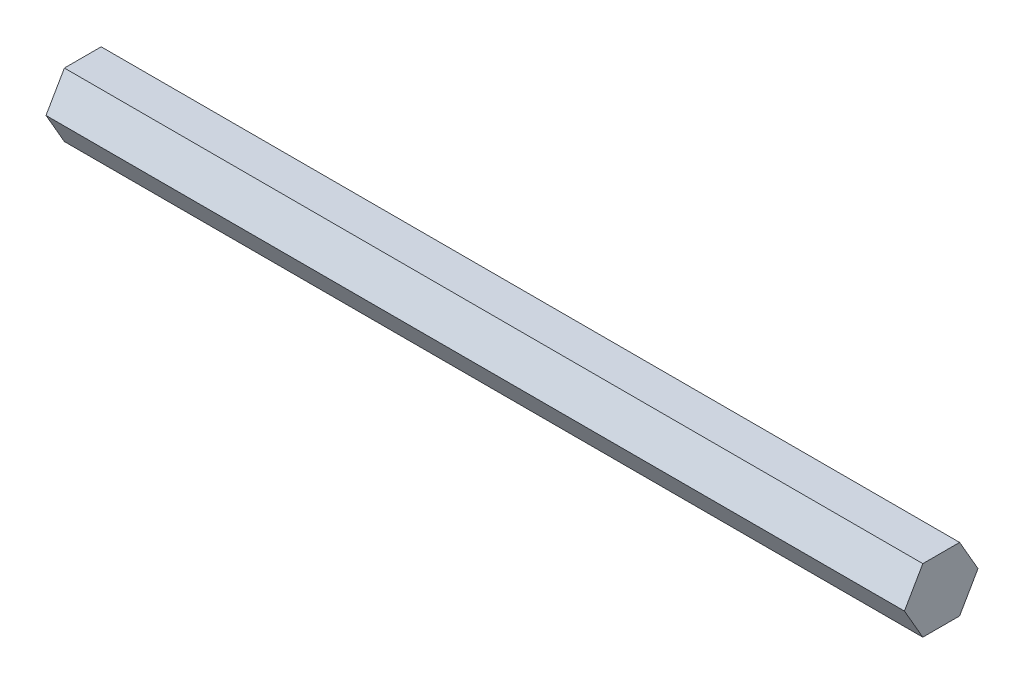
ISO-10303-21;
HEADER;
FILE_DESCRIPTION(('STEP AP214'),'2;1');
FILE_NAME('part.step','',(''),(''),'','','');
FILE_SCHEMA(('AUTOMOTIVE_DESIGN { 1 0 10303 214 1 1 1 1 }'));
ENDSEC;
DATA;
#1=APPLICATION_CONTEXT('core data for automotive mechanical design processes');
#2=APPLICATION_PROTOCOL_DEFINITION('international standard','automotive_design',2000,#1);
#3=PRODUCT_CONTEXT('',#1,'mechanical');
#4=PRODUCT('Part','Part','',(#3));
#5=PRODUCT_RELATED_PRODUCT_CATEGORY('part','',(#4));
#6=PRODUCT_DEFINITION_FORMATION('','',#4);
#7=PRODUCT_DEFINITION_CONTEXT('part definition',#1,'design');
#8=PRODUCT_DEFINITION('design','',#6,#7);
#9=PRODUCT_DEFINITION_SHAPE('','',#8);
#10=(LENGTH_UNIT() NAMED_UNIT(*) SI_UNIT(.MILLI.,.METRE.));
#11=(NAMED_UNIT(*) PLANE_ANGLE_UNIT() SI_UNIT($,.RADIAN.));
#12=(NAMED_UNIT(*) SI_UNIT($,.STERADIAN.) SOLID_ANGLE_UNIT());
#13=UNCERTAINTY_MEASURE_WITH_UNIT(LENGTH_MEASURE(1.E-05),#10,'distance_accuracy_value','');
#14=(GEOMETRIC_REPRESENTATION_CONTEXT(3) GLOBAL_UNCERTAINTY_ASSIGNED_CONTEXT((#13)) GLOBAL_UNIT_ASSIGNED_CONTEXT((#10,
#11,#12)) REPRESENTATION_CONTEXT('',''));
#15=CARTESIAN_POINT('',(0.,0.,0.));
#16=DIRECTION('',(0.,0.,1.));
#17=DIRECTION('',(1.,0.,0.));
#18=AXIS2_PLACEMENT_3D('',#15,#16,#17);
#19=CARTESIAN_POINT('',(171.45,-6.3627,3.67350655777283));
#20=DIRECTION('',(0.,0.5,-0.866025403784439));
#21=DIRECTION('',(0.,-0.866025403784439,-0.5));
#22=AXIS2_PLACEMENT_3D('',#19,#20,#21);
#23=PLANE('',#22);
#24=DIRECTION('',(0.,0.866025403784439,0.5));
#25=VECTOR('',#24,1.);
#26=CARTESIAN_POINT('',(0.,-6.3627,3.67350655777283));
#27=LINE('',#26,#25);
#28=CARTESIAN_POINT('',(0.,-6.3627,3.67350655777283));
#29=VERTEX_POINT('',#28);
#30=CARTESIAN_POINT('',(0.,0.,7.34701311554566));
#31=VERTEX_POINT('',#30);
#32=EDGE_CURVE('E118',#29,#31,#27,.T.);
#33=ORIENTED_EDGE('',*,*,#32,.F.);
#34=DIRECTION('',(-1.,0.,0.));
#35=VECTOR('',#34,1.);
#36=CARTESIAN_POINT('',(171.45,-6.3627,3.67350655777283));
#37=LINE('',#36,#35);
#38=CARTESIAN_POINT('',(171.45,-6.3627,3.67350655777283));
#39=VERTEX_POINT('',#38);
#40=EDGE_CURVE('E117',#39,#29,#37,.T.);
#41=ORIENTED_EDGE('',*,*,#40,.F.);
#42=DIRECTION('',(0.,0.866025403784439,0.5));
#43=VECTOR('',#42,1.);
#44=CARTESIAN_POINT('',(171.45,-6.3627,3.67350655777283));
#45=LINE('',#44,#43);
#46=CARTESIAN_POINT('',(171.45,0.,7.34701311554566));
#47=VERTEX_POINT('',#46);
#48=EDGE_CURVE('E130',#39,#47,#45,.T.);
#49=ORIENTED_EDGE('',*,*,#48,.T.);
#50=DIRECTION('',(-1.,0.,0.));
#51=VECTOR('',#50,1.);
#52=CARTESIAN_POINT('',(171.45,0.,7.34701311554566));
#53=LINE('',#52,#51);
#54=EDGE_CURVE('E11',#47,#31,#53,.T.);
#55=ORIENTED_EDGE('',*,*,#54,.T.);
#56=EDGE_LOOP('',(#33,#41,#49,#55));
#57=FACE_BOUND('',#56,.T.);
#58=ADVANCED_FACE('F35',(#57),#23,.F.);
#59=CARTESIAN_POINT('',(171.45,0.,7.34701311554566));
#60=DIRECTION('',(0.,-0.5,-0.866025403784439));
#61=DIRECTION('',(0.,-0.866025403784439,0.5));
#62=AXIS2_PLACEMENT_3D('',#59,#60,#61);
#63=PLANE('',#62);
#64=DIRECTION('',(0.,0.866025403784439,-0.5));
#65=VECTOR('',#64,1.);
#66=CARTESIAN_POINT('',(0.,0.,7.34701311554566));
#67=LINE('',#66,#65);
#68=CARTESIAN_POINT('',(0.,6.3627,3.67350655777283));
#69=VERTEX_POINT('',#68);
#70=EDGE_CURVE('E120',#31,#69,#67,.T.);
#71=ORIENTED_EDGE('',*,*,#70,.F.);
#72=ORIENTED_EDGE('',*,*,#54,.F.);
#73=DIRECTION('',(0.,0.866025403784439,-0.5));
#74=VECTOR('',#73,1.);
#75=CARTESIAN_POINT('',(171.45,0.,7.34701311554566));
#76=LINE('',#75,#74);
#77=CARTESIAN_POINT('',(171.45,6.3627,3.67350655777283));
#78=VERTEX_POINT('',#77);
#79=EDGE_CURVE('E83',#47,#78,#76,.T.);
#80=ORIENTED_EDGE('',*,*,#79,.T.);
#81=DIRECTION('',(-1.,0.,0.));
#82=VECTOR('',#81,1.);
#83=CARTESIAN_POINT('',(171.45,6.3627,3.67350655777283));
#84=LINE('',#83,#82);
#85=EDGE_CURVE('E43',#78,#69,#84,.T.);
#86=ORIENTED_EDGE('',*,*,#85,.T.);
#87=EDGE_LOOP('',(#71,#72,#80,#86));
#88=FACE_BOUND('',#87,.T.);
#89=ADVANCED_FACE('F136',(#88),#63,.F.);
#90=CARTESIAN_POINT('',(171.45,6.3627,3.67350655777283));
#91=DIRECTION('',(0.,-1.,0.));
#92=DIRECTION('',(0.,0.,1.));
#93=AXIS2_PLACEMENT_3D('',#90,#91,#92);
#94=PLANE('',#93);
#95=DIRECTION('',(0.,0.,-1.));
#96=VECTOR('',#95,1.);
#97=CARTESIAN_POINT('',(0.,6.3627,3.67350655777283));
#98=LINE('',#97,#96);
#99=CARTESIAN_POINT('',(0.,6.3627,-3.67350655777283));
#100=VERTEX_POINT('',#99);
#101=EDGE_CURVE('E123',#69,#100,#98,.T.);
#102=ORIENTED_EDGE('',*,*,#101,.F.);
#103=ORIENTED_EDGE('',*,*,#85,.F.);
#104=DIRECTION('',(0.,0.,-1.));
#105=VECTOR('',#104,1.);
#106=CARTESIAN_POINT('',(171.45,6.3627,3.67350655777283));
#107=LINE('',#106,#105);
#108=CARTESIAN_POINT('',(171.45,6.3627,-3.67350655777283));
#109=VERTEX_POINT('',#108);
#110=EDGE_CURVE('E111',#78,#109,#107,.T.);
#111=ORIENTED_EDGE('',*,*,#110,.T.);
#112=DIRECTION('',(-1.,0.,0.));
#113=VECTOR('',#112,1.);
#114=CARTESIAN_POINT('',(171.45,6.3627,-3.67350655777283));
#115=LINE('',#114,#113);
#116=EDGE_CURVE('E105',#109,#100,#115,.T.);
#117=ORIENTED_EDGE('',*,*,#116,.T.);
#118=EDGE_LOOP('',(#102,#103,#111,#117));
#119=FACE_BOUND('',#118,.T.);
#120=ADVANCED_FACE('F158',(#119),#94,.F.);
#121=CARTESIAN_POINT('',(171.45,6.3627,-3.67350655777283));
#122=DIRECTION('',(0.,-0.5,0.866025403784439));
#123=DIRECTION('',(0.,0.866025403784439,0.5));
#124=AXIS2_PLACEMENT_3D('',#121,#122,#123);
#125=PLANE('',#124);
#126=DIRECTION('',(0.,-0.866025403784439,-0.5));
#127=VECTOR('',#126,1.);
#128=CARTESIAN_POINT('',(0.,6.3627,-3.67350655777283));
#129=LINE('',#128,#127);
#130=CARTESIAN_POINT('',(0.,0.,-7.34701311554567));
#131=VERTEX_POINT('',#130);
#132=EDGE_CURVE('E126',#100,#131,#129,.T.);
#133=ORIENTED_EDGE('',*,*,#132,.F.);
#134=ORIENTED_EDGE('',*,*,#116,.F.);
#135=DIRECTION('',(0.,-0.866025403784439,-0.5));
#136=VECTOR('',#135,1.);
#137=CARTESIAN_POINT('',(171.45,6.3627,-3.67350655777283));
#138=LINE('',#137,#136);
#139=CARTESIAN_POINT('',(171.45,0.,-7.34701311554567));
#140=VERTEX_POINT('',#139);
#141=EDGE_CURVE('E95',#109,#140,#138,.T.);
#142=ORIENTED_EDGE('',*,*,#141,.T.);
#143=DIRECTION('',(-1.,0.,0.));
#144=VECTOR('',#143,1.);
#145=CARTESIAN_POINT('',(171.45,0.,-7.34701311554567));
#146=LINE('',#145,#144);
#147=EDGE_CURVE('E100',#140,#131,#146,.T.);
#148=ORIENTED_EDGE('',*,*,#147,.T.);
#149=EDGE_LOOP('',(#133,#134,#142,#148));
#150=FACE_BOUND('',#149,.T.);
#151=ADVANCED_FACE('F108',(#150),#125,.F.);
#152=CARTESIAN_POINT('',(171.45,0.,-7.34701311554567));
#153=DIRECTION('',(0.,0.5,0.866025403784439));
#154=DIRECTION('',(0.,0.866025403784439,-0.5));
#155=AXIS2_PLACEMENT_3D('',#152,#153,#154);
#156=PLANE('',#155);
#157=DIRECTION('',(0.,-0.866025403784439,0.5));
#158=VECTOR('',#157,1.);
#159=CARTESIAN_POINT('',(0.,0.,-7.34701311554567));
#160=LINE('',#159,#158);
#161=CARTESIAN_POINT('',(0.,-6.3627,-3.67350655777283));
#162=VERTEX_POINT('',#161);
#163=EDGE_CURVE('E102',#131,#162,#160,.T.);
#164=ORIENTED_EDGE('',*,*,#163,.F.);
#165=ORIENTED_EDGE('',*,*,#147,.F.);
#166=DIRECTION('',(0.,-0.866025403784439,0.5));
#167=VECTOR('',#166,1.);
#168=CARTESIAN_POINT('',(171.45,0.,-7.34701311554567));
#169=LINE('',#168,#167);
#170=CARTESIAN_POINT('',(171.45,-6.3627,-3.67350655777283));
#171=VERTEX_POINT('',#170);
#172=EDGE_CURVE('E91',#140,#171,#169,.T.);
#173=ORIENTED_EDGE('',*,*,#172,.T.);
#174=DIRECTION('',(-1.,0.,0.));
#175=VECTOR('',#174,1.);
#176=CARTESIAN_POINT('',(171.45,-6.3627,-3.67350655777283));
#177=LINE('',#176,#175);
#178=EDGE_CURVE('E106',#171,#162,#177,.T.);
#179=ORIENTED_EDGE('',*,*,#178,.T.);
#180=EDGE_LOOP('',(#164,#165,#173,#179));
#181=FACE_BOUND('',#180,.T.);
#182=ADVANCED_FACE('F101',(#181),#156,.F.);
#183=CARTESIAN_POINT('',(171.45,-6.3627,-3.67350655777283));
#184=DIRECTION('',(0.,1.,0.));
#185=DIRECTION('',(0.,0.,-1.));
#186=AXIS2_PLACEMENT_3D('',#183,#184,#185);
#187=PLANE('',#186);
#188=DIRECTION('',(0.,0.,1.));
#189=VECTOR('',#188,1.);
#190=CARTESIAN_POINT('',(0.,-6.3627,-3.67350655777283));
#191=LINE('',#190,#189);
#192=EDGE_CURVE('E71',#162,#29,#191,.T.);
#193=ORIENTED_EDGE('',*,*,#192,.F.);
#194=ORIENTED_EDGE('',*,*,#178,.F.);
#195=DIRECTION('',(0.,0.,1.));
#196=VECTOR('',#195,1.);
#197=CARTESIAN_POINT('',(171.45,-6.3627,-3.67350655777283));
#198=LINE('',#197,#196);
#199=EDGE_CURVE('E51',#171,#39,#198,.T.);
#200=ORIENTED_EDGE('',*,*,#199,.T.);
#201=ORIENTED_EDGE('',*,*,#40,.T.);
#202=EDGE_LOOP('',(#193,#194,#200,#201));
#203=FACE_BOUND('',#202,.T.);
#204=ADVANCED_FACE('F144',(#203),#187,.F.);
#205=CARTESIAN_POINT('',(171.45,0.,0.));
#206=DIRECTION('',(1.,0.,0.));
#207=DIRECTION('',(0.,0.,1.));
#208=AXIS2_PLACEMENT_3D('',#205,#206,#207);
#209=PLANE('',#208);
#210=ORIENTED_EDGE('',*,*,#48,.F.);
#211=ORIENTED_EDGE('',*,*,#199,.F.);
#212=ORIENTED_EDGE('',*,*,#172,.F.);
#213=ORIENTED_EDGE('',*,*,#141,.F.);
#214=ORIENTED_EDGE('',*,*,#110,.F.);
#215=ORIENTED_EDGE('',*,*,#79,.F.);
#216=EDGE_LOOP('',(#210,#211,#212,#213,#214,#215));
#217=FACE_BOUND('',#216,.T.);
#218=ADVANCED_FACE('F93',(#217),#209,.T.);
#219=CARTESIAN_POINT('',(0.,0.,0.));
#220=DIRECTION('',(1.,0.,0.));
#221=DIRECTION('',(0.,0.,1.));
#222=AXIS2_PLACEMENT_3D('',#219,#220,#221);
#223=PLANE('',#222);
#224=ORIENTED_EDGE('',*,*,#32,.T.);
#225=ORIENTED_EDGE('',*,*,#70,.T.);
#226=ORIENTED_EDGE('',*,*,#101,.T.);
#227=ORIENTED_EDGE('',*,*,#132,.T.);
#228=ORIENTED_EDGE('',*,*,#163,.T.);
#229=ORIENTED_EDGE('',*,*,#192,.T.);
#230=EDGE_LOOP('',(#224,#225,#226,#227,#228,#229));
#231=FACE_BOUND('',#230,.T.);
#232=ADVANCED_FACE('F138',(#231),#223,.F.);
#233=CLOSED_SHELL('',(#58,#89,#120,#151,#182,#204,#218,#232));
#234=MANIFOLD_SOLID_BREP('B2',#233);
#235=ADVANCED_BREP_SHAPE_REPRESENTATION('',(#18,#234),#14);
#236=SHAPE_DEFINITION_REPRESENTATION(#9,#235);
ENDSEC;
END-ISO-10303-21;
